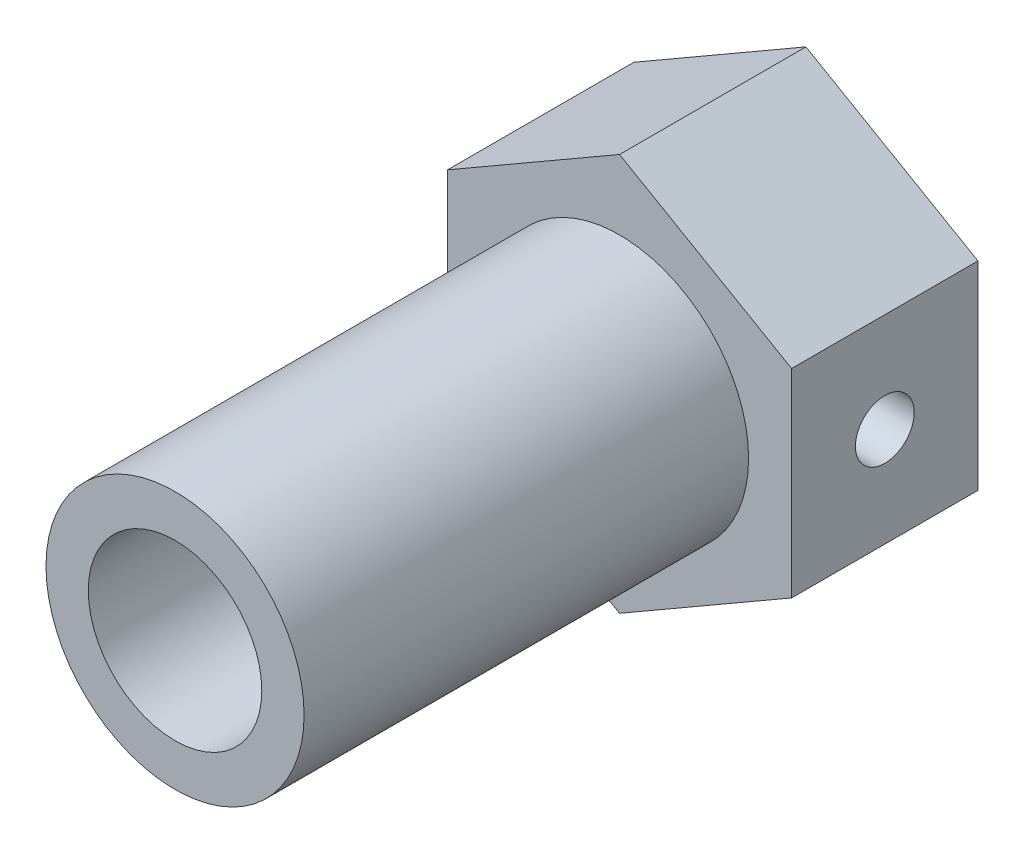
ISO-10303-21;
HEADER;
FILE_DESCRIPTION(('STEP AP214'),'2;1');
FILE_NAME('part.step','',(''),(''),'','','');
FILE_SCHEMA(('AUTOMOTIVE_DESIGN { 1 0 10303 214 1 1 1 1 }'));
ENDSEC;
DATA;
#1=APPLICATION_CONTEXT('core data for automotive mechanical design processes');
#2=APPLICATION_PROTOCOL_DEFINITION('international standard','automotive_design',2000,#1);
#3=PRODUCT_CONTEXT('',#1,'mechanical');
#4=PRODUCT('Part','Part','',(#3));
#5=PRODUCT_RELATED_PRODUCT_CATEGORY('part','',(#4));
#6=PRODUCT_DEFINITION_FORMATION('','',#4);
#7=PRODUCT_DEFINITION_CONTEXT('part definition',#1,'design');
#8=PRODUCT_DEFINITION('design','',#6,#7);
#9=PRODUCT_DEFINITION_SHAPE('','',#8);
#10=(LENGTH_UNIT() NAMED_UNIT(*) SI_UNIT(.MILLI.,.METRE.));
#11=(NAMED_UNIT(*) PLANE_ANGLE_UNIT() SI_UNIT($,.RADIAN.));
#12=(NAMED_UNIT(*) SI_UNIT($,.STERADIAN.) SOLID_ANGLE_UNIT());
#13=UNCERTAINTY_MEASURE_WITH_UNIT(LENGTH_MEASURE(1.E-05),#10,'distance_accuracy_value','');
#14=(GEOMETRIC_REPRESENTATION_CONTEXT(3) GLOBAL_UNCERTAINTY_ASSIGNED_CONTEXT((#13)) GLOBAL_UNIT_ASSIGNED_CONTEXT((#10,
#11,#12)) REPRESENTATION_CONTEXT('',''));
#15=CARTESIAN_POINT('',(0.,0.,0.));
#16=DIRECTION('',(0.,0.,1.));
#17=DIRECTION('',(1.,0.,0.));
#18=AXIS2_PLACEMENT_3D('',#15,#16,#17);
#19=CARTESIAN_POINT('',(11.9999999999999,6.92820323027564,13.));
#20=DIRECTION('',(-0.499999999999995,-0.866025403784442,0.));
#21=DIRECTION('',(0.866025403784442,-0.499999999999995,0.));
#22=AXIS2_PLACEMENT_3D('',#19,#20,#21);
#23=PLANE('',#22);
#24=DIRECTION('',(-0.866025403784442,0.499999999999995,0.));
#25=VECTOR('',#24,1.);
#26=CARTESIAN_POINT('',(11.9999999999999,6.92820323027564,0.));
#27=LINE('',#26,#25);
#28=CARTESIAN_POINT('',(11.9999999999999,6.92820323027564,0.));
#29=VERTEX_POINT('',#28);
#30=CARTESIAN_POINT('',(0.,13.856406460551,0.));
#31=VERTEX_POINT('',#30);
#32=EDGE_CURVE('E126',#29,#31,#27,.T.);
#33=ORIENTED_EDGE('',*,*,#32,.T.);
#34=DIRECTION('',(0.,0.,-1.));
#35=VECTOR('',#34,1.);
#36=CARTESIAN_POINT('',(0.,13.856406460551,13.));
#37=LINE('',#36,#35);
#38=CARTESIAN_POINT('',(0.,13.856406460551,13.));
#39=VERTEX_POINT('',#38);
#40=EDGE_CURVE('E144',#39,#31,#37,.T.);
#41=ORIENTED_EDGE('',*,*,#40,.F.);
#42=DIRECTION('',(-0.866025403784442,0.499999999999995,0.));
#43=VECTOR('',#42,1.);
#44=CARTESIAN_POINT('',(11.9999999999999,6.92820323027564,13.));
#45=LINE('',#44,#43);
#46=CARTESIAN_POINT('',(11.9999999999999,6.92820323027564,13.));
#47=VERTEX_POINT('',#46);
#48=EDGE_CURVE('E137',#47,#39,#45,.T.);
#49=ORIENTED_EDGE('',*,*,#48,.F.);
#50=DIRECTION('',(0.,0.,-1.));
#51=VECTOR('',#50,1.);
#52=CARTESIAN_POINT('',(11.9999999999999,6.92820323027564,13.));
#53=LINE('',#52,#51);
#54=EDGE_CURVE('E122',#47,#29,#53,.T.);
#55=ORIENTED_EDGE('',*,*,#54,.T.);
#56=EDGE_LOOP('',(#33,#41,#49,#55));
#57=FACE_BOUND('',#56,.T.);
#58=ADVANCED_FACE('F34',(#57),#23,.F.);
#59=CARTESIAN_POINT('',(0.,13.856406460551,13.));
#60=DIRECTION('',(0.500000000000001,-0.866025403784438,0.));
#61=DIRECTION('',(0.866025403784438,0.500000000000001,0.));
#62=AXIS2_PLACEMENT_3D('',#59,#60,#61);
#63=PLANE('',#62);
#64=DIRECTION('',(-0.866025403784438,-0.500000000000001,0.));
#65=VECTOR('',#64,1.);
#66=CARTESIAN_POINT('',(0.,13.856406460551,0.));
#67=LINE('',#66,#65);
#68=CARTESIAN_POINT('',(-12.,6.92820323027547,0.));
#69=VERTEX_POINT('',#68);
#70=EDGE_CURVE('E129',#31,#69,#67,.T.);
#71=ORIENTED_EDGE('',*,*,#70,.T.);
#72=DIRECTION('',(0.,0.,-1.));
#73=VECTOR('',#72,1.);
#74=CARTESIAN_POINT('',(-12.,6.92820323027547,13.));
#75=LINE('',#74,#73);
#76=CARTESIAN_POINT('',(-12.,6.92820323027547,13.));
#77=VERTEX_POINT('',#76);
#78=EDGE_CURVE('E141',#77,#69,#75,.T.);
#79=ORIENTED_EDGE('',*,*,#78,.F.);
#80=DIRECTION('',(-0.866025403784438,-0.500000000000001,0.));
#81=VECTOR('',#80,1.);
#82=CARTESIAN_POINT('',(0.,13.856406460551,13.));
#83=LINE('',#82,#81);
#84=EDGE_CURVE('E95',#39,#77,#83,.T.);
#85=ORIENTED_EDGE('',*,*,#84,.F.);
#86=ORIENTED_EDGE('',*,*,#40,.T.);
#87=EDGE_LOOP('',(#71,#79,#85,#86));
#88=FACE_BOUND('',#87,.T.);
#89=ADVANCED_FACE('F166',(#88),#63,.F.);
#90=CARTESIAN_POINT('',(-12.,6.92820323027547,13.));
#91=DIRECTION('',(1.,0.,0.));
#92=DIRECTION('',(0.,1.,0.));
#93=AXIS2_PLACEMENT_3D('',#90,#91,#92);
#94=PLANE('',#93);
#95=CARTESIAN_POINT('',(-12.,0.,6.5));
#96=DIRECTION('',(1.,0.,0.));
#97=DIRECTION('',(0.,1.,0.));
#98=AXIS2_PLACEMENT_3D('',#95,#96,#97);
#99=CIRCLE('',#98,2.05);
#100=CARTESIAN_POINT('',(-12.,2.05,6.5));
#101=VERTEX_POINT('',#100);
#102=EDGE_CURVE('E195',#101,#101,#99,.T.);
#103=ORIENTED_EDGE('',*,*,#102,.T.);
#104=EDGE_LOOP('',(#103));
#105=FACE_BOUND('',#104,.T.);
#106=DIRECTION('',(0.,-1.,0.));
#107=VECTOR('',#106,1.);
#108=CARTESIAN_POINT('',(-12.,6.92820323027547,0.));
#109=LINE('',#108,#107);
#110=CARTESIAN_POINT('',(-11.9999999999999,-6.92820323027555,0.));
#111=VERTEX_POINT('',#110);
#112=EDGE_CURVE('E132',#69,#111,#109,.T.);
#113=ORIENTED_EDGE('',*,*,#112,.T.);
#114=DIRECTION('',(0.,0.,-1.));
#115=VECTOR('',#114,1.);
#116=CARTESIAN_POINT('',(-11.9999999999999,-6.92820323027555,13.));
#117=LINE('',#116,#115);
#118=CARTESIAN_POINT('',(-11.9999999999999,-6.92820323027555,13.));
#119=VERTEX_POINT('',#118);
#120=EDGE_CURVE('E117',#119,#111,#117,.T.);
#121=ORIENTED_EDGE('',*,*,#120,.F.);
#122=DIRECTION('',(0.,-1.,0.));
#123=VECTOR('',#122,1.);
#124=CARTESIAN_POINT('',(-12.,6.92820323027547,13.));
#125=LINE('',#124,#123);
#126=EDGE_CURVE('E108',#77,#119,#125,.T.);
#127=ORIENTED_EDGE('',*,*,#126,.F.);
#128=ORIENTED_EDGE('',*,*,#78,.T.);
#129=EDGE_LOOP('',(#113,#121,#127,#128));
#130=FACE_BOUND('',#129,.T.);
#131=ADVANCED_FACE('F171',(#105,#130),#94,.F.);
#132=CARTESIAN_POINT('',(-11.9999999999999,-6.92820323027555,13.));
#133=DIRECTION('',(0.499999999999995,0.866025403784441,0.));
#134=DIRECTION('',(-0.866025403784442,0.499999999999995,0.));
#135=AXIS2_PLACEMENT_3D('',#132,#133,#134);
#136=PLANE('',#135);
#137=DIRECTION('',(0.866025403784441,-0.499999999999995,0.));
#138=VECTOR('',#137,1.);
#139=CARTESIAN_POINT('',(-11.9999999999999,-6.92820323027555,0.));
#140=LINE('',#139,#138);
#141=CARTESIAN_POINT('',(0.,-13.856406460551,0.));
#142=VERTEX_POINT('',#141);
#143=EDGE_CURVE('E116',#111,#142,#140,.T.);
#144=ORIENTED_EDGE('',*,*,#143,.T.);
#145=DIRECTION('',(0.,0.,-1.));
#146=VECTOR('',#145,1.);
#147=CARTESIAN_POINT('',(0.,-13.856406460551,13.));
#148=LINE('',#147,#146);
#149=CARTESIAN_POINT('',(0.,-13.856406460551,13.));
#150=VERTEX_POINT('',#149);
#151=EDGE_CURVE('E113',#150,#142,#148,.T.);
#152=ORIENTED_EDGE('',*,*,#151,.F.);
#153=DIRECTION('',(0.866025403784441,-0.499999999999995,0.));
#154=VECTOR('',#153,1.);
#155=CARTESIAN_POINT('',(-11.9999999999999,-6.92820323027555,13.));
#156=LINE('',#155,#154);
#157=EDGE_CURVE('E102',#119,#150,#156,.T.);
#158=ORIENTED_EDGE('',*,*,#157,.F.);
#159=ORIENTED_EDGE('',*,*,#120,.T.);
#160=EDGE_LOOP('',(#144,#152,#158,#159));
#161=FACE_BOUND('',#160,.T.);
#162=ADVANCED_FACE('F114',(#161),#136,.F.);
#163=CARTESIAN_POINT('',(0.,-13.856406460551,13.));
#164=DIRECTION('',(-0.500000000000007,0.866025403784434,0.));
#165=DIRECTION('',(-0.866025403784435,-0.500000000000007,0.));
#166=AXIS2_PLACEMENT_3D('',#163,#164,#165);
#167=PLANE('',#166);
#168=DIRECTION('',(0.866025403784434,0.500000000000007,0.));
#169=VECTOR('',#168,1.);
#170=CARTESIAN_POINT('',(0.,-13.856406460551,0.));
#171=LINE('',#170,#169);
#172=CARTESIAN_POINT('',(12.,-6.92820323027539,0.));
#173=VERTEX_POINT('',#172);
#174=EDGE_CURVE('E80',#142,#173,#171,.T.);
#175=ORIENTED_EDGE('',*,*,#174,.T.);
#176=DIRECTION('',(0.,0.,-1.));
#177=VECTOR('',#176,1.);
#178=CARTESIAN_POINT('',(12.,-6.92820323027539,13.));
#179=LINE('',#178,#177);
#180=CARTESIAN_POINT('',(12.,-6.92820323027539,13.));
#181=VERTEX_POINT('',#180);
#182=EDGE_CURVE('E118',#181,#173,#179,.T.);
#183=ORIENTED_EDGE('',*,*,#182,.F.);
#184=DIRECTION('',(0.866025403784434,0.500000000000007,0.));
#185=VECTOR('',#184,1.);
#186=CARTESIAN_POINT('',(0.,-13.856406460551,13.));
#187=LINE('',#186,#185);
#188=EDGE_CURVE('E106',#150,#181,#187,.T.);
#189=ORIENTED_EDGE('',*,*,#188,.F.);
#190=ORIENTED_EDGE('',*,*,#151,.T.);
#191=EDGE_LOOP('',(#175,#183,#189,#190));
#192=FACE_BOUND('',#191,.T.);
#193=ADVANCED_FACE('F120',(#192),#167,.F.);
#194=CARTESIAN_POINT('',(12.,-6.92820323027539,13.));
#195=DIRECTION('',(-1.,0.,0.));
#196=DIRECTION('',(0.,-1.,0.));
#197=AXIS2_PLACEMENT_3D('',#194,#195,#196);
#198=PLANE('',#197);
#199=CARTESIAN_POINT('',(12.,0.,6.5));
#200=DIRECTION('',(-1.,0.,0.));
#201=DIRECTION('',(0.,-1.,0.));
#202=AXIS2_PLACEMENT_3D('',#199,#200,#201);
#203=CIRCLE('',#202,2.05);
#204=CARTESIAN_POINT('',(12.,-2.05,6.5));
#205=VERTEX_POINT('',#204);
#206=EDGE_CURVE('E198',#205,#205,#203,.T.);
#207=ORIENTED_EDGE('',*,*,#206,.T.);
#208=EDGE_LOOP('',(#207));
#209=FACE_BOUND('',#208,.T.);
#210=DIRECTION('',(0.,1.,0.));
#211=VECTOR('',#210,1.);
#212=CARTESIAN_POINT('',(12.,-6.92820323027539,0.));
#213=LINE('',#212,#211);
#214=EDGE_CURVE('E86',#173,#29,#213,.T.);
#215=ORIENTED_EDGE('',*,*,#214,.T.);
#216=ORIENTED_EDGE('',*,*,#54,.F.);
#217=DIRECTION('',(0.,1.,0.));
#218=VECTOR('',#217,1.);
#219=CARTESIAN_POINT('',(12.,-6.92820323027539,13.));
#220=LINE('',#219,#218);
#221=EDGE_CURVE('E57',#181,#47,#220,.T.);
#222=ORIENTED_EDGE('',*,*,#221,.F.);
#223=ORIENTED_EDGE('',*,*,#182,.T.);
#224=EDGE_LOOP('',(#215,#216,#222,#223));
#225=FACE_BOUND('',#224,.T.);
#226=ADVANCED_FACE('F227',(#209,#225),#198,.F.);
#227=CARTESIAN_POINT('',(0.,0.,13.));
#228=DIRECTION('',(0.,0.,1.));
#229=DIRECTION('',(1.,0.,0.));
#230=AXIS2_PLACEMENT_3D('',#227,#228,#229);
#231=PLANE('',#230);
#232=CARTESIAN_POINT('',(0.,0.,13.));
#233=DIRECTION('',(0.,0.,1.));
#234=DIRECTION('',(1.,0.,0.));
#235=AXIS2_PLACEMENT_3D('',#232,#233,#234);
#236=CIRCLE('',#235,9.);
#237=CARTESIAN_POINT('',(9.,0.,13.));
#238=VERTEX_POINT('',#237);
#239=EDGE_CURVE('E48',#238,#238,#236,.T.);
#240=ORIENTED_EDGE('',*,*,#239,.F.);
#241=EDGE_LOOP('',(#240));
#242=FACE_BOUND('',#241,.T.);
#243=ORIENTED_EDGE('',*,*,#48,.T.);
#244=ORIENTED_EDGE('',*,*,#84,.T.);
#245=ORIENTED_EDGE('',*,*,#126,.T.);
#246=ORIENTED_EDGE('',*,*,#157,.T.);
#247=ORIENTED_EDGE('',*,*,#188,.T.);
#248=ORIENTED_EDGE('',*,*,#221,.T.);
#249=EDGE_LOOP('',(#243,#244,#245,#246,#247,#248));
#250=FACE_BOUND('',#249,.T.);
#251=ADVANCED_FACE('F104',(#242,#250),#231,.T.);
#252=CARTESIAN_POINT('',(0.,0.,0.));
#253=DIRECTION('',(0.,0.,1.));
#254=DIRECTION('',(1.,0.,0.));
#255=AXIS2_PLACEMENT_3D('',#252,#253,#254);
#256=PLANE('',#255);
#257=CARTESIAN_POINT('',(0.,0.,0.));
#258=DIRECTION('',(0.,0.,-1.));
#259=DIRECTION('',(-1.,0.,0.));
#260=AXIS2_PLACEMENT_3D('',#257,#258,#259);
#261=CIRCLE('',#260,8.);
#262=CARTESIAN_POINT('',(-8.,0.,0.));
#263=VERTEX_POINT('',#262);
#264=EDGE_CURVE('E11',#263,#263,#261,.T.);
#265=ORIENTED_EDGE('',*,*,#264,.F.);
#266=EDGE_LOOP('',(#265));
#267=FACE_BOUND('',#266,.T.);
#268=ORIENTED_EDGE('',*,*,#32,.F.);
#269=ORIENTED_EDGE('',*,*,#214,.F.);
#270=ORIENTED_EDGE('',*,*,#174,.F.);
#271=ORIENTED_EDGE('',*,*,#143,.F.);
#272=ORIENTED_EDGE('',*,*,#112,.F.);
#273=ORIENTED_EDGE('',*,*,#70,.F.);
#274=EDGE_LOOP('',(#268,#269,#270,#271,#272,#273));
#275=FACE_BOUND('',#274,.T.);
#276=ADVANCED_FACE('F176',(#267,#275),#256,.F.);
#277=CARTESIAN_POINT('',(0.,0.,44.));
#278=DIRECTION('',(0.,0.,-1.));
#279=DIRECTION('',(-1.,0.,0.));
#280=AXIS2_PLACEMENT_3D('',#277,#278,#279);
#281=CYLINDRICAL_SURFACE('',#280,9.);
#282=CARTESIAN_POINT('',(0.,0.,44.));
#283=DIRECTION('',(0.,0.,1.));
#284=DIRECTION('',(1.,0.,0.));
#285=AXIS2_PLACEMENT_3D('',#282,#283,#284);
#286=CIRCLE('',#285,9.);
#287=CARTESIAN_POINT('',(9.,0.,44.));
#288=VERTEX_POINT('',#287);
#289=EDGE_CURVE('E130',#288,#288,#286,.T.);
#290=ORIENTED_EDGE('',*,*,#289,.F.);
#291=EDGE_LOOP('',(#290));
#292=FACE_BOUND('',#291,.T.);
#293=ORIENTED_EDGE('',*,*,#239,.T.);
#294=EDGE_LOOP('',(#293));
#295=FACE_BOUND('',#294,.T.);
#296=ADVANCED_FACE('F217',(#292,#295),#281,.T.);
#297=CARTESIAN_POINT('',(0.,0.,44.));
#298=DIRECTION('',(0.,0.,1.));
#299=DIRECTION('',(1.,0.,0.));
#300=AXIS2_PLACEMENT_3D('',#297,#298,#299);
#301=PLANE('',#300);
#302=CARTESIAN_POINT('',(0.,0.,44.));
#303=DIRECTION('',(0.,0.,1.));
#304=DIRECTION('',(1.,0.,0.));
#305=AXIS2_PLACEMENT_3D('',#302,#303,#304);
#306=CIRCLE('',#305,6.05);
#307=CARTESIAN_POINT('',(6.05,0.,44.));
#308=VERTEX_POINT('',#307);
#309=EDGE_CURVE('E189',#308,#308,#306,.F.);
#310=ORIENTED_EDGE('',*,*,#309,.T.);
#311=EDGE_LOOP('',(#310));
#312=FACE_BOUND('',#311,.T.);
#313=ORIENTED_EDGE('',*,*,#289,.T.);
#314=EDGE_LOOP('',(#313));
#315=FACE_BOUND('',#314,.T.);
#316=ADVANCED_FACE('F213',(#312,#315),#301,.T.);
#317=CARTESIAN_POINT('',(0.,0.,-1.));
#318=DIRECTION('',(0.,0.,1.));
#319=DIRECTION('',(1.,0.,0.));
#320=AXIS2_PLACEMENT_3D('',#317,#318,#319);
#321=CYLINDRICAL_SURFACE('',#320,8.);
#322=CARTESIAN_POINT('',(0.,0.,-1.));
#323=DIRECTION('',(0.,0.,-1.));
#324=DIRECTION('',(-1.,0.,0.));
#325=AXIS2_PLACEMENT_3D('',#322,#323,#324);
#326=CIRCLE('',#325,8.);
#327=CARTESIAN_POINT('',(-8.,0.,-1.));
#328=VERTEX_POINT('',#327);
#329=EDGE_CURVE('E185',#328,#328,#326,.T.);
#330=ORIENTED_EDGE('',*,*,#329,.F.);
#331=EDGE_LOOP('',(#330));
#332=FACE_BOUND('',#331,.T.);
#333=ORIENTED_EDGE('',*,*,#264,.T.);
#334=EDGE_LOOP('',(#333));
#335=FACE_BOUND('',#334,.T.);
#336=ADVANCED_FACE('F216',(#332,#335),#321,.T.);
#337=CARTESIAN_POINT('',(0.,0.,-1.));
#338=DIRECTION('',(0.,0.,-1.));
#339=DIRECTION('',(-1.,0.,0.));
#340=AXIS2_PLACEMENT_3D('',#337,#338,#339);
#341=PLANE('',#340);
#342=CARTESIAN_POINT('',(0.,0.,-1.));
#343=DIRECTION('',(0.,0.,-1.));
#344=DIRECTION('',(-1.,0.,0.));
#345=AXIS2_PLACEMENT_3D('',#342,#343,#344);
#346=CIRCLE('',#345,6.05);
#347=CARTESIAN_POINT('',(-6.05,0.,-1.));
#348=VERTEX_POINT('',#347);
#349=EDGE_CURVE('E192',#348,#348,#346,.T.);
#350=ORIENTED_EDGE('',*,*,#349,.F.);
#351=EDGE_LOOP('',(#350));
#352=FACE_BOUND('',#351,.T.);
#353=ORIENTED_EDGE('',*,*,#329,.T.);
#354=EDGE_LOOP('',(#353));
#355=FACE_BOUND('',#354,.T.);
#356=ADVANCED_FACE('F206',(#352,#355),#341,.T.);
#357=CARTESIAN_POINT('',(0.,0.,61.1119841047145));
#358=DIRECTION('',(0.,0.,-1.));
#359=DIRECTION('',(-1.,0.,0.));
#360=AXIS2_PLACEMENT_3D('',#357,#358,#359);
#361=CYLINDRICAL_SURFACE('',#360,6.05);
#362=CARTESIAN_POINT('',(-6.05,0.,8.55));
#363=CARTESIAN_POINT('',(-6.05000059018109,0.111749418874001,8.55000089848398));
#364=CARTESIAN_POINT('',(-6.04687546428108,0.2234927055388,8.54083288955088));
#365=CARTESIAN_POINT('',(-6.03471708103567,0.443681612655486,8.50451980577058));
#366=CARTESIAN_POINT('',(-6.02568340398505,0.552126998273126,8.4773734538566));
#367=CARTESIAN_POINT('',(-6.00268802055083,0.762513965744146,8.40614546000945));
#368=CARTESIAN_POINT('',(-5.98873471944937,0.864466292543468,8.36209269175875));
#369=CARTESIAN_POINT('',(-5.95731987501072,1.05953465154598,8.25843494520768));
#370=CARTESIAN_POINT('',(-5.93985760425152,1.15264884566984,8.19882674144313));
#371=CARTESIAN_POINT('',(-5.90256206338385,1.33071684838393,8.0635201650809));
#372=CARTESIAN_POINT('',(-5.88267063752873,1.41531231043497,7.98736632672171));
#373=CARTESIAN_POINT('',(-5.84307418098655,1.57080698676391,7.82209830996279));
#374=CARTESIAN_POINT('',(-5.82336919418891,1.64170304879781,7.73298115694185));
#375=CARTESIAN_POINT('',(-5.78573228454089,1.76986073525177,7.54105572772942));
#376=CARTESIAN_POINT('',(-5.76787096202472,1.82665149432557,7.43791784566919));
#377=CARTESIAN_POINT('',(-5.73683055731775,1.92192729753709,7.2228521709767));
#378=CARTESIAN_POINT('',(-5.72364999205465,1.96041814121464,7.11092717624211));
#379=CARTESIAN_POINT('',(-5.70407698679591,2.01664818440666,6.88554678067756));
#380=CARTESIAN_POINT('',(-5.69746504823637,2.03506056913821,6.77227896978218));
#381=CARTESIAN_POINT('',(-5.69112947506238,2.05271569411779,6.54408352383801));
#382=CARTESIAN_POINT('',(-5.69140362710624,2.05196459393209,6.42915643398819));
#383=CARTESIAN_POINT('',(-5.69861729069925,2.03183573070204,6.20669597683705));
#384=CARTESIAN_POINT('',(-5.70524006699788,2.01334306550927,6.09907045560499));
#385=CARTESIAN_POINT('',(-5.7238854575544,1.95970233718731,5.88855104348173));
#386=CARTESIAN_POINT('',(-5.73590873855824,1.92455221750043,5.78565773855929));
#387=CARTESIAN_POINT('',(-5.7642215495813,1.83802715234994,5.58553908386466));
#388=CARTESIAN_POINT('',(-5.78057817137953,1.78639417585852,5.48843520249744));
#389=CARTESIAN_POINT('',(-5.81568730240587,1.66854823429548,5.3039930666381));
#390=CARTESIAN_POINT('',(-5.83444052130407,1.60233094636118,5.21665771918549));
#391=CARTESIAN_POINT('',(-5.87346910520842,1.45297057156901,5.04926709398543));
#392=CARTESIAN_POINT('',(-5.89377194915422,1.36910595044538,4.96986068915135));
#393=CARTESIAN_POINT('',(-5.93272719233484,1.18900234561343,4.82606659854043));
#394=CARTESIAN_POINT('',(-5.95137942242076,1.09276209616924,4.76168045088102));
#395=CARTESIAN_POINT('',(-5.98519109537666,0.889228097375351,4.64920876407508));
#396=CARTESIAN_POINT('',(-6.00031161433619,0.781828447783895,4.60130235798671));
#397=CARTESIAN_POINT('',(-6.02507299167332,0.559858959105783,4.52443966005764));
#398=CARTESIAN_POINT('',(-6.03471581961238,0.445291713673401,4.49547655638539));
#399=CARTESIAN_POINT('',(-6.04710652114441,0.217728338516044,4.45848441297469));
#400=CARTESIAN_POINT('',(-6.0501428431108,0.104890193797985,4.44957897794928));
#401=CARTESIAN_POINT('',(-6.04984683640884,-0.120693928751761,4.450451480249));
#402=CARTESIAN_POINT('',(-6.0465156234613,-0.233439919267735,4.46022614444315));
#403=CARTESIAN_POINT('',(-6.0340493464123,-0.452096570709581,4.49749098760135));
#404=CARTESIAN_POINT('',(-6.02509211874875,-0.558110826993341,4.52443870048185));
#405=CARTESIAN_POINT('',(-6.00245315906542,-0.764067146626138,4.59460195841257));
#406=CARTESIAN_POINT('',(-5.98877082104558,-0.864008429176017,4.63781959016));
#407=CARTESIAN_POINT('',(-5.95761019229661,-1.0579665562946,4.74057570004187));
#408=CARTESIAN_POINT('',(-5.94004007313936,-1.1517531235984,4.80052018915921));
#409=CARTESIAN_POINT('',(-5.90309046418837,-1.32821846592834,4.934553943399));
#410=CARTESIAN_POINT('',(-5.8837104066597,-1.41089373563379,5.008647654464));
#411=CARTESIAN_POINT('',(-5.84416756413602,-1.56683907059438,5.17299571475391));
#412=CARTESIAN_POINT('',(-5.82401083476513,-1.6394839118279,5.26384623515698));
#413=CARTESIAN_POINT('',(-5.78611834877513,-1.76858010493298,5.4568776390535));
#414=CARTESIAN_POINT('',(-5.76838263185535,-1.82503119127891,5.55905870829348));
#415=CARTESIAN_POINT('',(-5.73750455006519,-1.91990674131373,5.77197756361106));
#416=CARTESIAN_POINT('',(-5.72435573109691,-1.95835656038056,5.88270305678446));
#417=CARTESIAN_POINT('',(-5.7043552815073,-2.01588104863577,6.10960877708349));
#418=CARTESIAN_POINT('',(-5.69750068804173,-2.03496483432987,6.22578641065572));
#419=CARTESIAN_POINT('',(-5.69120917197218,-2.05249017571046,6.45366760930362));
#420=CARTESIAN_POINT('',(-5.69139809086838,-2.05197293264496,6.56528163281923));
#421=CARTESIAN_POINT('',(-5.69824287525504,-2.03288675443146,6.78674299293012));
#422=CARTESIAN_POINT('',(-5.70489833092824,-2.01431896323825,6.89659044103381));
#423=CARTESIAN_POINT('',(-5.72364324394803,-1.96040598385375,7.10917609989319));
#424=CARTESIAN_POINT('',(-5.73561970332584,-1.92540885965689,7.2120133356168));
#425=CARTESIAN_POINT('',(-5.76361216564426,-1.83991535298641,7.41043345137837));
#426=CARTESIAN_POINT('',(-5.77962908352889,-1.78941545941638,7.50601468193979));
#427=CARTESIAN_POINT('',(-5.81479263386442,-1.67171027016949,7.69185518159691));
#428=CARTESIAN_POINT('',(-5.83404737294696,-1.60385762575283,7.78168384705198));
#429=CARTESIAN_POINT('',(-5.87307529798002,-1.45445543268095,7.94901592404739));
#430=CARTESIAN_POINT('',(-5.8928486314085,-1.37290195134338,8.0265157842619));
#431=CARTESIAN_POINT('',(-5.93165396368539,-1.19442165867087,8.17018094440217));
#432=CARTESIAN_POINT('',(-5.95062284673388,-1.09700354352057,8.23575513086959));
#433=CARTESIAN_POINT('',(-5.98479831012951,-0.891896106813973,8.34953121535658));
#434=CARTESIAN_POINT('',(-6.00000570404209,-0.784209013309361,8.39773687101502));
#435=CARTESIAN_POINT('',(-6.02450067001326,-0.565332066785165,8.47379445116037));
#436=CARTESIAN_POINT('',(-6.03397042323994,-0.4543824549269,8.50227738916195));
#437=CARTESIAN_POINT('',(-6.04671885864199,-0.228952371681606,8.54037687753538));
#438=CARTESIAN_POINT('',(-6.04999939543505,-0.114472968461158,8.54999907961823));
#439=CARTESIAN_POINT('',(-6.05,0.,8.55));
#440=B_SPLINE_CURVE_WITH_KNOTS('',3,(#362,#363,#364,#365,#366,#367,#368,#369,#370,#371,#372,
#373,#374,#375,#376,#377,#378,#379,#380,#381,#382,#383,#384,#385,#386,#387,#388,#389,#390,#391,
#392,#393,#394,#395,#396,#397,#398,#399,#400,#401,#402,#403,#404,#405,#406,#407,#408,#409,#410,
#411,#412,#413,#414,#415,#416,#417,#418,#419,#420,#421,#422,#423,#424,#425,#426,#427,#428,#429,
#430,#431,#432,#433,#434,#435,#436,#437,#438,#439),.UNSPECIFIED.,.T.,.F.,(4,2,2,2,2,2,2,2,2,2,2,
2,2,2,2,2,2,2,2,2,2,2,2,2,2,2,2,2,2,2,2,2,2,2,2,2,2,2,4),(0.,0.334826873342713,
0.669677533201533,1.00395884396233,1.33830952406286,1.68340355655949,2.02857690118547,
2.38406733428795,2.73944503148842,3.0825019401559,3.4254485841645,3.75213026747455,
4.07885229397313,4.41096287048213,4.74317201901782,5.09334190833825,5.44354764033493,
5.79744794957969,6.15122092956759,6.48920892004227,6.82713769361896,7.15488792214894,
7.48268020058812,7.81924918908438,8.15592410820496,8.50843352218517,8.86094871585798,
9.21296587523535,9.56481724654653,9.89800595492746,10.2311735488261,10.5575810478607,
10.8840625268882,11.2251784724798,11.5663924996663,11.9215213734744,12.2765733698255,
12.6196634463358,12.9626506985141),.UNSPECIFIED.);
#441=CARTESIAN_POINT('',(-6.05,0.,8.55));
#442=VERTEX_POINT('',#441);
#443=EDGE_CURVE('E37',#442,#442,#440,.T.);
#444=ORIENTED_EDGE('',*,*,#443,.T.);
#445=EDGE_LOOP('',(#444));
#446=FACE_BOUND('',#445,.T.);
#447=CARTESIAN_POINT('',(6.05,0.,4.45));
#448=CARTESIAN_POINT('',(6.05000059018109,0.111749418874001,4.44999910151602));
#449=CARTESIAN_POINT('',(6.04687546428108,0.223492705538799,4.45916711044912));
#450=CARTESIAN_POINT('',(6.03471708103567,0.443681612655486,4.49548019422942));
#451=CARTESIAN_POINT('',(6.02568340398505,0.552126998273126,4.5226265461434));
#452=CARTESIAN_POINT('',(6.00268802055083,0.762513965744146,4.59385453999055));
#453=CARTESIAN_POINT('',(5.98873471944937,0.864466292543467,4.63790730824125));
#454=CARTESIAN_POINT('',(5.95731987501072,1.05953465154598,4.74156505479233));
#455=CARTESIAN_POINT('',(5.93985760425152,1.15264884566984,4.80117325855687));
#456=CARTESIAN_POINT('',(5.90256206338385,1.33071684838393,4.9364798349191));
#457=CARTESIAN_POINT('',(5.88267063752873,1.41531231043497,5.01263367327829));
#458=CARTESIAN_POINT('',(5.84307418098655,1.57080698676391,5.17790169003721));
#459=CARTESIAN_POINT('',(5.82336919418891,1.64170304879781,5.26701884305815));
#460=CARTESIAN_POINT('',(5.78573228454089,1.76986073525177,5.45894427227058));
#461=CARTESIAN_POINT('',(5.76787096202472,1.82665149432557,5.56208215433081));
#462=CARTESIAN_POINT('',(5.73683055731775,1.9219272975371,5.7771478290233));
#463=CARTESIAN_POINT('',(5.72364999205465,1.96041814121464,5.88907282375789));
#464=CARTESIAN_POINT('',(5.70407698679591,2.01664818440666,6.11445321932244));
#465=CARTESIAN_POINT('',(5.69746504823637,2.03506056913821,6.22772103021782));
#466=CARTESIAN_POINT('',(5.69112947506238,2.05271569411779,6.45591647616199));
#467=CARTESIAN_POINT('',(5.69140362710624,2.05196459393209,6.57084356601181));
#468=CARTESIAN_POINT('',(5.69861729069925,2.03183573070204,6.79330402316295));
#469=CARTESIAN_POINT('',(5.70524006699788,2.01334306550927,6.90092954439501));
#470=CARTESIAN_POINT('',(5.7238854575544,1.95970233718731,7.11144895651827));
#471=CARTESIAN_POINT('',(5.73590873855824,1.92455221750043,7.21434226144071));
#472=CARTESIAN_POINT('',(5.7642215495813,1.83802715234994,7.41446091613534));
#473=CARTESIAN_POINT('',(5.78057817137953,1.78639417585852,7.51156479750256));
#474=CARTESIAN_POINT('',(5.81568730240587,1.66854823429548,7.6960069333619));
#475=CARTESIAN_POINT('',(5.83444052130407,1.60233094636118,7.78334228081451));
#476=CARTESIAN_POINT('',(5.87346910520842,1.45297057156901,7.95073290601457));
#477=CARTESIAN_POINT('',(5.89377194915422,1.36910595044538,8.03013931084865));
#478=CARTESIAN_POINT('',(5.93272719233484,1.18900234561343,8.17393340145957));
#479=CARTESIAN_POINT('',(5.95137942242077,1.09276209616924,8.23831954911897));
#480=CARTESIAN_POINT('',(5.98519109537666,0.889228097375352,8.35079123592492));
#481=CARTESIAN_POINT('',(6.00031161433619,0.781828447783896,8.39869764201329));
#482=CARTESIAN_POINT('',(6.02507299167332,0.559858959105784,8.47556033994236));
#483=CARTESIAN_POINT('',(6.03471581961238,0.445291713673402,8.50452344361461));
#484=CARTESIAN_POINT('',(6.04710652114441,0.217728338516044,8.54151558702531));
#485=CARTESIAN_POINT('',(6.0501428431108,0.104890193797986,8.55042102205072));
#486=CARTESIAN_POINT('',(6.04984683640884,-0.120693928751761,8.549548519751));
#487=CARTESIAN_POINT('',(6.0465156234613,-0.233439919267735,8.53977385555685));
#488=CARTESIAN_POINT('',(6.0340493464123,-0.452096570709581,8.50250901239865));
#489=CARTESIAN_POINT('',(6.02509211874875,-0.55811082699334,8.47556129951815));
#490=CARTESIAN_POINT('',(6.00245315906542,-0.764067146626137,8.40539804158743));
#491=CARTESIAN_POINT('',(5.98877082104558,-0.864008429176017,8.36218040984));
#492=CARTESIAN_POINT('',(5.95761019229661,-1.0579665562946,8.25942429995813));
#493=CARTESIAN_POINT('',(5.94004007313936,-1.1517531235984,8.19947981084079));
#494=CARTESIAN_POINT('',(5.90309046418837,-1.32821846592834,8.065446056601));
#495=CARTESIAN_POINT('',(5.8837104066597,-1.41089373563379,7.991352345536));
#496=CARTESIAN_POINT('',(5.84416756413602,-1.56683907059438,7.82700428524609));
#497=CARTESIAN_POINT('',(5.82401083476513,-1.6394839118279,7.73615376484302));
#498=CARTESIAN_POINT('',(5.78611834877513,-1.76858010493297,7.54312236094651));
#499=CARTESIAN_POINT('',(5.76838263185535,-1.82503119127891,7.44094129170652));
#500=CARTESIAN_POINT('',(5.73750455006519,-1.91990674131372,7.22802243638894));
#501=CARTESIAN_POINT('',(5.72435573109691,-1.95835656038056,7.11729694321554));
#502=CARTESIAN_POINT('',(5.7043552815073,-2.01588104863577,6.89039122291651));
#503=CARTESIAN_POINT('',(5.69750068804173,-2.03496483432986,6.77421358934428));
#504=CARTESIAN_POINT('',(5.69120917197218,-2.05249017571046,6.54633239069638));
#505=CARTESIAN_POINT('',(5.69139809086838,-2.05197293264496,6.43471836718077));
#506=CARTESIAN_POINT('',(5.69824287525504,-2.03288675443146,6.21325700706987));
#507=CARTESIAN_POINT('',(5.70489833092824,-2.01431896323825,6.10340955896619));
#508=CARTESIAN_POINT('',(5.72364324394803,-1.96040598385375,5.89082390010681));
#509=CARTESIAN_POINT('',(5.73561970332584,-1.92540885965689,5.7879866643832));
#510=CARTESIAN_POINT('',(5.76361216564426,-1.83991535298641,5.58956654862163));
#511=CARTESIAN_POINT('',(5.77962908352889,-1.78941545941638,5.49398531806021));
#512=CARTESIAN_POINT('',(5.81479263386442,-1.67171027016949,5.30814481840309));
#513=CARTESIAN_POINT('',(5.83404737294696,-1.60385762575283,5.21831615294802));
#514=CARTESIAN_POINT('',(5.87307529798002,-1.45445543268095,5.05098407595261));
#515=CARTESIAN_POINT('',(5.8928486314085,-1.37290195134338,4.9734842157381));
#516=CARTESIAN_POINT('',(5.93165396368539,-1.19442165867087,4.82981905559783));
#517=CARTESIAN_POINT('',(5.95062284673388,-1.09700354352057,4.76424486913041));
#518=CARTESIAN_POINT('',(5.98479831012951,-0.891896106813972,4.65046878464341));
#519=CARTESIAN_POINT('',(6.00000570404209,-0.78420901330936,4.60226312898498));
#520=CARTESIAN_POINT('',(6.02450067001326,-0.565332066785164,4.52620554883963));
#521=CARTESIAN_POINT('',(6.03397042323994,-0.4543824549269,4.49772261083805));
#522=CARTESIAN_POINT('',(6.04671885864199,-0.228952371681606,4.45962312246462));
#523=CARTESIAN_POINT('',(6.04999939543505,-0.114472968461158,4.45000092038177));
#524=CARTESIAN_POINT('',(6.05,0.,4.45));
#525=B_SPLINE_CURVE_WITH_KNOTS('',3,(#447,#448,#449,#450,#451,#452,#453,#454,#455,#456,#457,
#458,#459,#460,#461,#462,#463,#464,#465,#466,#467,#468,#469,#470,#471,#472,#473,#474,#475,#476,
#477,#478,#479,#480,#481,#482,#483,#484,#485,#486,#487,#488,#489,#490,#491,#492,#493,#494,#495,
#496,#497,#498,#499,#500,#501,#502,#503,#504,#505,#506,#507,#508,#509,#510,#511,#512,#513,#514,
#515,#516,#517,#518,#519,#520,#521,#522,#523,#524),.UNSPECIFIED.,.T.,.F.,(4,2,2,2,2,2,2,2,2,2,2,
2,2,2,2,2,2,2,2,2,2,2,2,2,2,2,2,2,2,2,2,2,2,2,2,2,2,2,4),(0.,0.334826873342713,
0.669677533201532,1.00395884396233,1.33830952406286,1.68340355655949,2.02857690118547,
2.38406733428795,2.73944503148842,3.0825019401559,3.4254485841645,3.75213026747455,
4.07885229397313,4.41096287048213,4.74317201901781,5.09334190833825,5.44354764033493,
5.79744794957969,6.15122092956759,6.48920892004227,6.82713769361896,7.15488792214894,
7.48268020058812,7.81924918908437,8.15592410820496,8.50843352218517,8.86094871585797,
9.21296587523535,9.56481724654653,9.89800595492746,10.2311735488261,10.5575810478607,
10.8840625268882,11.2251784724798,11.5663924996663,11.9215213734744,12.2765733698255,
12.6196634463358,12.9626506985141),.UNSPECIFIED.);
#526=CARTESIAN_POINT('',(6.05,0.,4.45));
#527=VERTEX_POINT('',#526);
#528=EDGE_CURVE('E145',#527,#527,#525,.T.);
#529=ORIENTED_EDGE('',*,*,#528,.T.);
#530=EDGE_LOOP('',(#529));
#531=FACE_BOUND('',#530,.T.);
#532=ORIENTED_EDGE('',*,*,#349,.T.);
#533=EDGE_LOOP('',(#532));
#534=FACE_BOUND('',#533,.T.);
#535=ORIENTED_EDGE('',*,*,#309,.F.);
#536=EDGE_LOOP('',(#535));
#537=FACE_BOUND('',#536,.T.);
#538=ADVANCED_FACE('F150',(#446,#531,#534,#537),#361,.F.);
#539=CARTESIAN_POINT('',(-25.,0.,6.5));
#540=DIRECTION('',(1.,0.,0.));
#541=DIRECTION('',(0.,0.,-1.));
#542=AXIS2_PLACEMENT_3D('',#539,#540,#541);
#543=CYLINDRICAL_SURFACE('',#542,2.05);
#544=ORIENTED_EDGE('',*,*,#528,.F.);
#545=EDGE_LOOP('',(#544));
#546=FACE_BOUND('',#545,.T.);
#547=ORIENTED_EDGE('',*,*,#206,.F.);
#548=EDGE_LOOP('',(#547));
#549=FACE_BOUND('',#548,.T.);
#550=ADVANCED_FACE('F156',(#546,#549),#543,.F.);
#551=ORIENTED_EDGE('',*,*,#443,.F.);
#552=EDGE_LOOP('',(#551));
#553=FACE_BOUND('',#552,.T.);
#554=ORIENTED_EDGE('',*,*,#102,.F.);
#555=EDGE_LOOP('',(#554));
#556=FACE_BOUND('',#555,.T.);
#557=ADVANCED_FACE('F153',(#553,#556),#543,.F.);
#558=CLOSED_SHELL('',(#58,#89,#131,#162,#193,#226,#251,#276,#296,#316,#336,#356,#538,#550,#557));
#559=MANIFOLD_SOLID_BREP('B2',#558);
#560=ADVANCED_BREP_SHAPE_REPRESENTATION('',(#18,#559),#14);
#561=SHAPE_DEFINITION_REPRESENTATION(#9,#560);
ENDSEC;
END-ISO-10303-21;
